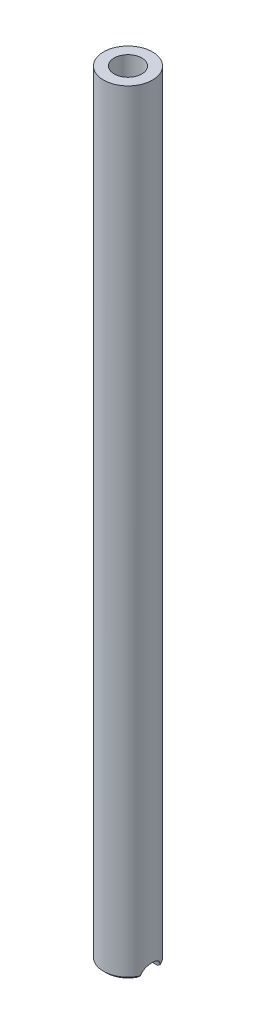
ISO-10303-21;
HEADER;
FILE_DESCRIPTION(('STEP AP214'),'2;1');
FILE_NAME('part.step','',(''),(''),'','','');
FILE_SCHEMA(('AUTOMOTIVE_DESIGN { 1 0 10303 214 1 1 1 1 }'));
ENDSEC;
DATA;
#1=APPLICATION_CONTEXT('core data for automotive mechanical design processes');
#2=APPLICATION_PROTOCOL_DEFINITION('international standard','automotive_design',2000,#1);
#3=PRODUCT_CONTEXT('',#1,'mechanical');
#4=PRODUCT('Part','Part','',(#3));
#5=PRODUCT_RELATED_PRODUCT_CATEGORY('part','',(#4));
#6=PRODUCT_DEFINITION_FORMATION('','',#4);
#7=PRODUCT_DEFINITION_CONTEXT('part definition',#1,'design');
#8=PRODUCT_DEFINITION('design','',#6,#7);
#9=PRODUCT_DEFINITION_SHAPE('','',#8);
#10=(LENGTH_UNIT() NAMED_UNIT(*) SI_UNIT(.MILLI.,.METRE.));
#11=(NAMED_UNIT(*) PLANE_ANGLE_UNIT() SI_UNIT($,.RADIAN.));
#12=(NAMED_UNIT(*) SI_UNIT($,.STERADIAN.) SOLID_ANGLE_UNIT());
#13=UNCERTAINTY_MEASURE_WITH_UNIT(LENGTH_MEASURE(1.E-05),#10,'distance_accuracy_value','');
#14=(GEOMETRIC_REPRESENTATION_CONTEXT(3) GLOBAL_UNCERTAINTY_ASSIGNED_CONTEXT((#13)) GLOBAL_UNIT_ASSIGNED_CONTEXT((#10,
#11,#12)) REPRESENTATION_CONTEXT('',''));
#15=CARTESIAN_POINT('',(0.,0.,0.));
#16=DIRECTION('',(0.,0.,1.));
#17=DIRECTION('',(1.,0.,0.));
#18=AXIS2_PLACEMENT_3D('',#15,#16,#17);
#19=CARTESIAN_POINT('',(0.,0.,0.));
#20=DIRECTION('',(0.,1.,0.));
#21=DIRECTION('',(0.,0.,1.));
#22=AXIS2_PLACEMENT_3D('',#19,#20,#21);
#23=PLANE('',#22);
#24=CARTESIAN_POINT('',(0.,0.,0.));
#25=DIRECTION('',(0.,1.,0.));
#26=DIRECTION('',(0.,0.,1.));
#27=AXIS2_PLACEMENT_3D('',#24,#25,#26);
#28=CIRCLE('',#27,2.69999999999997);
#29=CARTESIAN_POINT('',(2.39321958875483,0.,1.25));
#30=VERTEX_POINT('',#29);
#31=CARTESIAN_POINT('',(-2.39321958875483,0.,1.25));
#32=VERTEX_POINT('',#31);
#33=EDGE_CURVE('E130',#30,#32,#28,.F.);
#34=ORIENTED_EDGE('',*,*,#33,.T.);
#35=DIRECTION('',(1.,0.,0.));
#36=VECTOR('',#35,1.);
#37=CARTESIAN_POINT('',(-3.,0.,1.25));
#38=LINE('',#37,#36);
#39=CARTESIAN_POINT('',(-1.15217186218029,0.,1.25));
#40=VERTEX_POINT('',#39);
#41=EDGE_CURVE('E72',#32,#40,#38,.T.);
#42=ORIENTED_EDGE('',*,*,#41,.T.);
#43=CARTESIAN_POINT('',(0.,0.,0.));
#44=DIRECTION('',(0.,1.,0.));
#45=DIRECTION('',(0.,0.,1.));
#46=AXIS2_PLACEMENT_3D('',#43,#44,#45);
#47=CIRCLE('',#46,1.7);
#48=CARTESIAN_POINT('',(1.15217186218029,0.,1.25));
#49=VERTEX_POINT('',#48);
#50=EDGE_CURVE('E213',#40,#49,#47,.T.);
#51=ORIENTED_EDGE('',*,*,#50,.T.);
#52=EDGE_CURVE('E212',#49,#30,#38,.T.);
#53=ORIENTED_EDGE('',*,*,#52,.T.);
#54=EDGE_LOOP('',(#34,#42,#51,#53));
#55=FACE_BOUND('',#54,.T.);
#56=ADVANCED_FACE('F41',(#55),#23,.F.);
#57=CARTESIAN_POINT('',(0.,0.300000000000022,0.));
#58=DIRECTION('',(0.,1.,0.));
#59=DIRECTION('',(0.,0.,1.));
#60=AXIS2_PLACEMENT_3D('',#57,#58,#59);
#61=CONICAL_SURFACE('',#60,3.,0.785398163397467);
#62=CARTESIAN_POINT('',(2.78004389893349,0.330199999999623,1.20559858991301));
#63=CARTESIAN_POINT('',(2.74479798492367,0.301039250505393,1.21358054683991));
#64=CARTESIAN_POINT('',(2.70950752574411,0.271641005138676,1.22050000654771));
#65=CARTESIAN_POINT('',(2.63903695036296,0.212454470924361,1.23218251707802));
#66=CARTESIAN_POINT('',(2.60385676660136,0.182667230043783,1.23695047222051));
#67=CARTESIAN_POINT('',(2.53364287260164,0.122653263979588,1.24433536313533));
#68=CARTESIAN_POINT('',(2.49860916534385,0.0924265299092034,1.24695225535038));
#69=CARTESIAN_POINT('',(2.42874315256099,0.0314715601289161,1.24997570753094));
#70=CARTESIAN_POINT('',(2.39391149439429,0.000742332058989382,1.25037717720973));
#71=CARTESIAN_POINT('',(2.35928889286577,-0.0302000000000021,1.24963513074817));
#72=B_SPLINE_CURVE_WITH_KNOTS('',3,(#62,#63,#64,#65,#66,#67,#68,#69,#70,#71),.UNSPECIFIED.,.F.,
.F.,(4,2,2,2,4),(0.,0.139296579859182,0.278274011240721,0.417254256733252,0.556553698967687),.UNSPECIFIED.);
#73=CARTESIAN_POINT('',(2.74362898366379,0.300000000000022,1.21346610995115));
#74=VERTEX_POINT('',#73);
#75=EDGE_CURVE('E11',#74,#30,#72,.T.);
#76=ORIENTED_EDGE('',*,*,#75,.F.);
#77=CARTESIAN_POINT('',(0.,0.300000000000022,0.));
#78=DIRECTION('',(0.,1.,0.));
#79=DIRECTION('',(0.,0.,1.));
#80=AXIS2_PLACEMENT_3D('',#77,#78,#79);
#81=CIRCLE('',#80,3.);
#82=CARTESIAN_POINT('',(-2.74362898366379,0.300000000000022,1.21346610995115));
#83=VERTEX_POINT('',#82);
#84=EDGE_CURVE('E107',#83,#74,#81,.T.);
#85=ORIENTED_EDGE('',*,*,#84,.F.);
#86=CARTESIAN_POINT('',(-2.35928889286577,-0.0302000000000022,1.24963513074817));
#87=CARTESIAN_POINT('',(-2.3939114943943,0.000742332058995156,1.25037717720973));
#88=CARTESIAN_POINT('',(-2.42874315256101,0.0314715601289274,1.24997570753094));
#89=CARTESIAN_POINT('',(-2.49860916534387,0.0924265299092255,1.24695225535038));
#90=CARTESIAN_POINT('',(-2.53364287260167,0.122653263979615,1.24433536313533));
#91=CARTESIAN_POINT('',(-2.6038567666014,0.18266723004382,1.2369504722205));
#92=CARTESIAN_POINT('',(-2.63903695036301,0.212454470924404,1.23218251707801));
#93=CARTESIAN_POINT('',(-2.70950752574417,0.271641005138729,1.2205000065477));
#94=CARTESIAN_POINT('',(-2.74479798492374,0.301039250505451,1.2135805468399));
#95=CARTESIAN_POINT('',(-2.78004389893357,0.330199999999686,1.205598589913));
#96=B_SPLINE_CURVE_WITH_KNOTS('',3,(#86,#87,#88,#89,#90,#91,#92,#93,#94,#95),.UNSPECIFIED.,.F.,
.F.,(4,2,2,2,4),(0.,0.13929944223446,0.278279687727017,0.417257119108579,0.556553698967787),.UNSPECIFIED.);
#97=EDGE_CURVE('E114',#32,#83,#96,.T.);
#98=ORIENTED_EDGE('',*,*,#97,.F.);
#99=ORIENTED_EDGE('',*,*,#33,.F.);
#100=EDGE_LOOP('',(#76,#85,#98,#99));
#101=FACE_BOUND('',#100,.T.);
#102=ADVANCED_FACE('F124',(#101),#61,.T.);
#103=CARTESIAN_POINT('',(0.,95.,0.));
#104=DIRECTION('',(0.,-1.,0.));
#105=DIRECTION('',(0.,0.,-1.));
#106=AXIS2_PLACEMENT_3D('',#103,#104,#105);
#107=CYLINDRICAL_SURFACE('',#106,3.);
#108=CARTESIAN_POINT('',(2.74362898366379,0.300000000000022,-1.21346610995115));
#109=VERTEX_POINT('',#108);
#110=CARTESIAN_POINT('',(-2.74362898366379,0.300000000000022,-1.21346610995115));
#111=VERTEX_POINT('',#110);
#112=EDGE_CURVE('E109',#109,#111,#81,.T.);
#113=ORIENTED_EDGE('',*,*,#112,.T.);
#114=CARTESIAN_POINT('',(-2.74362898366379,0.300000000000022,-1.21346610995115));
#115=CARTESIAN_POINT('',(-2.751060054905,0.368455864463638,-1.19658209205574));
#116=CARTESIAN_POINT('',(-2.7609331536276,0.435081513295248,-1.17393074308736));
#117=CARTESIAN_POINT('',(-2.78398978427248,0.563002058486706,-1.11819258930886));
#118=CARTESIAN_POINT('',(-2.79716445453636,0.624310642584936,-1.08513365928918));
#119=CARTESIAN_POINT('',(-2.82528384442318,0.740213004383044,-1.0096396436127));
#120=CARTESIAN_POINT('',(-2.8402256850275,0.794817416343522,-0.967219713565076));
#121=CARTESIAN_POINT('',(-2.87028936262594,0.896330744515326,-0.873980410450537));
#122=CARTESIAN_POINT('',(-2.88541132964195,0.943233688759202,-0.823154579900579));
#123=CARTESIAN_POINT('',(-2.91487778112239,1.02992540620389,-0.711984182172451));
#124=CARTESIAN_POINT('',(-2.92916535313126,1.06934574388158,-0.651335807758729));
#125=CARTESIAN_POINT('',(-2.95466202726987,1.13733154115001,-0.523643070705675));
#126=CARTESIAN_POINT('',(-2.96587246471617,1.16590171122093,-0.456601499453774));
#127=CARTESIAN_POINT('',(-2.98355800407859,1.21017141003826,-0.320756110513793));
#128=CARTESIAN_POINT('',(-2.99020233559345,1.22633385631333,-0.252125907773266));
#129=CARTESIAN_POINT('',(-2.99868714276918,1.2468821028172,-0.112843714150842));
#130=CARTESIAN_POINT('',(-3.00052989830909,1.25127349219473,-0.0421926989057744));
#131=CARTESIAN_POINT('',(-2.9992481198465,1.24819380302362,0.0940122822266089));
#132=CARTESIAN_POINT('',(-2.99645021816439,1.2415028030499,0.159588643183516));
#133=CARTESIAN_POINT('',(-2.98678829034567,1.21799776603746,0.288582028235826));
#134=CARTESIAN_POINT('',(-2.97992423728568,1.20118366197019,0.351999038030486));
#135=CARTESIAN_POINT('',(-2.96279659507227,1.15803885544299,0.475085676545811));
#136=CARTESIAN_POINT('',(-2.95252891532552,1.13169669835846,0.534750692840206));
#137=CARTESIAN_POINT('',(-2.92955510415442,1.07032791809374,0.648924765978427));
#138=CARTESIAN_POINT('',(-2.91684796851908,1.0352977167085,0.703431685629269));
#139=CARTESIAN_POINT('',(-2.88923562099981,0.954831009694065,0.809646669737968));
#140=CARTESIAN_POINT('',(-2.87424018942949,0.908854637051669,0.860922714642156));
#141=CARTESIAN_POINT('',(-2.84428575882966,0.809149733201179,0.955243847629041));
#142=CARTESIAN_POINT('',(-2.82932675363899,0.755422621216253,0.998290439243244));
#143=CARTESIAN_POINT('',(-2.80028029064609,0.638306921053591,1.0771684279978));
#144=CARTESIAN_POINT('',(-2.78627840718246,0.5745615424782,1.11250917785741));
#145=CARTESIAN_POINT('',(-2.76797396971356,0.474616776016498,1.15696961262403));
#146=CARTESIAN_POINT('',(-2.76231477138213,0.440517889267516,1.1703804173556));
#147=CARTESIAN_POINT('',(-2.75209700815376,0.371108426760499,1.19420468847869));
#148=CARTESIAN_POINT('',(-2.74753906509135,0.335797179222732,1.20461646207265));
#149=CARTESIAN_POINT('',(-2.74362898366379,0.300000000000022,1.21346610995115));
#150=B_SPLINE_CURVE_WITH_KNOTS('',3,(#114,#115,#116,#117,#118,#119,#120,#121,#122,#123,#124,
#125,#126,#127,#128,#129,#130,#131,#132,#133,#134,#135,#136,#137,#138,#139,#140,#141,#142,#143,
#144,#145,#146,#147,#148,#149),.UNSPECIFIED.,.F.,.F.,(4,2,2,2,2,2,2,2,2,2,2,2,2,2,2,2,2,4),(0.,
0.212207559242973,0.423851526781467,0.635155320994401,0.846622201032945,1.0667188784059,
1.28671989371306,1.49804944124082,1.70927862720475,1.90626164625781,2.1032459696174,
2.30046789893446,2.49777119015316,2.70829018256221,2.9187706760512,3.14017921358695,
3.2512690669007,3.36242150234821),.UNSPECIFIED.);
#151=EDGE_CURVE('E103',#111,#83,#150,.T.);
#152=ORIENTED_EDGE('',*,*,#151,.T.);
#153=ORIENTED_EDGE('',*,*,#84,.T.);
#154=CARTESIAN_POINT('',(2.74362898366379,0.300000000000022,1.21346610995115));
#155=CARTESIAN_POINT('',(2.751060054905,0.368455864463638,1.19658209205574));
#156=CARTESIAN_POINT('',(2.7609331536276,0.435081513295248,1.17393074308736));
#157=CARTESIAN_POINT('',(2.78398978427248,0.563002058486706,1.11819258930886));
#158=CARTESIAN_POINT('',(2.79716445453636,0.624310642584936,1.08513365928918));
#159=CARTESIAN_POINT('',(2.82528384442318,0.740213004383044,1.0096396436127));
#160=CARTESIAN_POINT('',(2.8402256850275,0.794817416343521,0.967219713565076));
#161=CARTESIAN_POINT('',(2.87028936262594,0.896330744515325,0.873980410450538));
#162=CARTESIAN_POINT('',(2.88541132964195,0.943233688759202,0.82315457990058));
#163=CARTESIAN_POINT('',(2.91487778112239,1.02992540620389,0.711984182172452));
#164=CARTESIAN_POINT('',(2.92916535313126,1.06934574388158,0.65133580775873));
#165=CARTESIAN_POINT('',(2.95466202726987,1.13733154115001,0.523643070705676));
#166=CARTESIAN_POINT('',(2.96587246471617,1.16590171122093,0.456601499453775));
#167=CARTESIAN_POINT('',(2.98355800407859,1.21017141003826,0.320756110513794));
#168=CARTESIAN_POINT('',(2.99020233559345,1.22633385631333,0.252125907773267));
#169=CARTESIAN_POINT('',(2.99868714276918,1.2468821028172,0.112843714150842));
#170=CARTESIAN_POINT('',(3.00052989830909,1.25127349219473,0.0421926989057749));
#171=CARTESIAN_POINT('',(2.9992481198465,1.24819380302362,-0.0940122822266084));
#172=CARTESIAN_POINT('',(2.99645021816439,1.2415028030499,-0.159588643183515));
#173=CARTESIAN_POINT('',(2.98678829034567,1.21799776603746,-0.288582028235826));
#174=CARTESIAN_POINT('',(2.97992423728568,1.20118366197019,-0.351999038030486));
#175=CARTESIAN_POINT('',(2.96279659507227,1.15803885544299,-0.475085676545811));
#176=CARTESIAN_POINT('',(2.95252891532552,1.13169669835846,-0.534750692840205));
#177=CARTESIAN_POINT('',(2.92955510415442,1.07032791809374,-0.648924765978426));
#178=CARTESIAN_POINT('',(2.91684796851908,1.0352977167085,-0.703431685629269));
#179=CARTESIAN_POINT('',(2.88923562099981,0.954831009694065,-0.809646669737968));
#180=CARTESIAN_POINT('',(2.87424018942949,0.908854637051669,-0.860922714642156));
#181=CARTESIAN_POINT('',(2.84428575882966,0.809149733201179,-0.955243847629041));
#182=CARTESIAN_POINT('',(2.82932675363899,0.755422621216253,-0.998290439243244));
#183=CARTESIAN_POINT('',(2.80028029064609,0.638306921053591,-1.0771684279978));
#184=CARTESIAN_POINT('',(2.78627840718246,0.574561542478201,-1.11250917785741));
#185=CARTESIAN_POINT('',(2.76797396971356,0.474616776016498,-1.15696961262403));
#186=CARTESIAN_POINT('',(2.76231477138213,0.440517889267517,-1.1703804173556));
#187=CARTESIAN_POINT('',(2.75209700815376,0.371108426760499,-1.19420468847869));
#188=CARTESIAN_POINT('',(2.74753906509135,0.335797179222732,-1.20461646207265));
#189=CARTESIAN_POINT('',(2.74362898366379,0.300000000000023,-1.21346610995115));
#190=B_SPLINE_CURVE_WITH_KNOTS('',3,(#154,#155,#156,#157,#158,#159,#160,#161,#162,#163,#164,
#165,#166,#167,#168,#169,#170,#171,#172,#173,#174,#175,#176,#177,#178,#179,#180,#181,#182,#183,
#184,#185,#186,#187,#188,#189),.UNSPECIFIED.,.F.,.F.,(4,2,2,2,2,2,2,2,2,2,2,2,2,2,2,2,2,4),(0.,
0.212207559242973,0.423851526781467,0.635155320994401,0.846622201032944,1.0667188784059,
1.28671989371306,1.49804944124082,1.70927862720475,1.90626164625781,2.1032459696174,
2.30046789893446,2.49777119015316,2.70829018256221,2.9187706760512,3.14017921358694,
3.2512690669007,3.36242150234821),.UNSPECIFIED.);
#191=EDGE_CURVE('E177',#74,#109,#190,.T.);
#192=ORIENTED_EDGE('',*,*,#191,.T.);
#193=EDGE_LOOP('',(#113,#152,#153,#192));
#194=FACE_BOUND('',#193,.T.);
#195=CARTESIAN_POINT('',(0.,95.,0.));
#196=DIRECTION('',(0.,1.,0.));
#197=DIRECTION('',(0.,0.,1.));
#198=AXIS2_PLACEMENT_3D('',#195,#196,#197);
#199=CIRCLE('',#198,3.);
#200=CARTESIAN_POINT('',(0.,95.,3.));
#201=VERTEX_POINT('',#200);
#202=EDGE_CURVE('E126',#201,#201,#199,.T.);
#203=ORIENTED_EDGE('',*,*,#202,.F.);
#204=EDGE_LOOP('',(#203));
#205=FACE_BOUND('',#204,.T.);
#206=ADVANCED_FACE('F104',(#194,#205),#107,.T.);
#207=CARTESIAN_POINT('',(0.,95.,0.));
#208=DIRECTION('',(0.,1.,0.));
#209=DIRECTION('',(0.,0.,1.));
#210=AXIS2_PLACEMENT_3D('',#207,#208,#209);
#211=PLANE('',#210);
#212=CARTESIAN_POINT('',(0.,95.,0.));
#213=DIRECTION('',(0.,1.,0.));
#214=DIRECTION('',(0.,0.,1.));
#215=AXIS2_PLACEMENT_3D('',#212,#213,#214);
#216=CIRCLE('',#215,1.7);
#217=CARTESIAN_POINT('',(0.,95.,1.7));
#218=VERTEX_POINT('',#217);
#219=EDGE_CURVE('E216',#218,#218,#216,.T.);
#220=ORIENTED_EDGE('',*,*,#219,.F.);
#221=EDGE_LOOP('',(#220));
#222=FACE_BOUND('',#221,.T.);
#223=ORIENTED_EDGE('',*,*,#202,.T.);
#224=EDGE_LOOP('',(#223));
#225=FACE_BOUND('',#224,.T.);
#226=ADVANCED_FACE('F193',(#222,#225),#211,.T.);
#227=CARTESIAN_POINT('',(-2.39321958875483,0.,-1.25));
#228=VERTEX_POINT('',#227);
#229=CARTESIAN_POINT('',(2.39321958875483,0.,-1.25));
#230=VERTEX_POINT('',#229);
#231=EDGE_CURVE('E121',#228,#230,#28,.F.);
#232=ORIENTED_EDGE('',*,*,#231,.T.);
#233=DIRECTION('',(1.,0.,0.));
#234=VECTOR('',#233,1.);
#235=CARTESIAN_POINT('',(-3.,0.,-1.25));
#236=LINE('',#235,#234);
#237=CARTESIAN_POINT('',(1.15217186218029,0.,-1.25));
#238=VERTEX_POINT('',#237);
#239=EDGE_CURVE('E64',#230,#238,#236,.F.);
#240=ORIENTED_EDGE('',*,*,#239,.T.);
#241=CARTESIAN_POINT('',(-1.15217186218029,0.,-1.25));
#242=VERTEX_POINT('',#241);
#243=EDGE_CURVE('E132',#238,#242,#47,.T.);
#244=ORIENTED_EDGE('',*,*,#243,.T.);
#245=EDGE_CURVE('E184',#242,#228,#236,.F.);
#246=ORIENTED_EDGE('',*,*,#245,.T.);
#247=EDGE_LOOP('',(#232,#240,#244,#246));
#248=FACE_BOUND('',#247,.T.);
#249=ADVANCED_FACE('F194',(#248),#23,.F.);
#250=CARTESIAN_POINT('',(0.,0.,0.));
#251=DIRECTION('',(0.,1.,0.));
#252=DIRECTION('',(0.,0.,1.));
#253=AXIS2_PLACEMENT_3D('',#250,#251,#252);
#254=CYLINDRICAL_SURFACE('',#253,1.7);
#255=ORIENTED_EDGE('',*,*,#50,.F.);
#256=CARTESIAN_POINT('',(-1.15217186218029,0.,1.25));
#257=CARTESIAN_POINT('',(-1.1521540899547,0.0297051466107362,1.25000630450715));
#258=CARTESIAN_POINT('',(-1.15332174879054,0.0593847221858209,1.24894060891229));
#259=CARTESIAN_POINT('',(-1.15786773204684,0.11837031891241,1.2447320161652));
#260=CARTESIAN_POINT('',(-1.16124181921655,0.147676946525465,1.24159310033373));
#261=CARTESIAN_POINT('',(-1.1743268914488,0.233970858054492,1.22926798870381));
#262=CARTESIAN_POINT('',(-1.18700910991442,0.290117901568079,1.21716955337492));
#263=CARTESIAN_POINT('',(-1.21796118296609,0.398272887247139,1.18618602719933));
#264=CARTESIAN_POINT('',(-1.23619128914568,0.450307059782674,1.16734905208315));
#265=CARTESIAN_POINT('',(-1.27610820937935,0.550516987375731,1.12357898133538));
#266=CARTESIAN_POINT('',(-1.29780715302868,0.598678277384545,1.09862432411704));
#267=CARTESIAN_POINT('',(-1.34724598478576,0.699925156034752,1.03766741502119));
#268=CARTESIAN_POINT('',(-1.3753340260917,0.752112868883314,1.00045735012618));
#269=CARTESIAN_POINT('',(-1.4313836121581,0.850280308006511,0.918484052279946));
#270=CARTESIAN_POINT('',(-1.45934507730188,0.896256542624432,0.873716602640341));
#271=CARTESIAN_POINT('',(-1.51830686796386,0.989599252387722,0.767533705898734));
#272=CARTESIAN_POINT('',(-1.54885314755543,1.03552356501881,0.704572657941425));
#273=CARTESIAN_POINT('',(-1.60355062895877,1.11567367929434,0.569142601689355));
#274=CARTESIAN_POINT('',(-1.6277151377284,1.14992386732399,0.496693856488348));
#275=CARTESIAN_POINT('',(-1.66093160836044,1.1963991890053,0.366625268428228));
#276=CARTESIAN_POINT('',(-1.67233598938644,1.21213516508566,0.310850412328854));
#277=CARTESIAN_POINT('',(-1.68954664396107,1.23577309246722,0.196835689263943));
#278=CARTESIAN_POINT('',(-1.69535777308365,1.24368183885601,0.138598006250379));
#279=CARTESIAN_POINT('',(-1.70088709773096,1.25120878448093,0.0211542971693632));
#280=CARTESIAN_POINT('',(-1.70059063733024,1.25080704164863,-0.0380537174062736));
#281=CARTESIAN_POINT('',(-1.69389681335986,1.24169071214258,-0.155479091389756));
#282=CARTESIAN_POINT('',(-1.6874979287251,1.23297405292693,-0.213696200125995));
#283=CARTESIAN_POINT('',(-1.66944048577033,1.20813955335051,-0.325717677185374));
#284=CARTESIAN_POINT('',(-1.65794995885032,1.19225788669021,-0.379602725454546));
#285=CARTESIAN_POINT('',(-1.63060131779162,1.15392401142064,-0.483780446987167));
#286=CARTESIAN_POINT('',(-1.61474226639481,1.13147039274756,-0.534072346428433));
#287=CARTESIAN_POINT('',(-1.57771394413741,1.07800488782843,-0.635652006372165));
#288=CARTESIAN_POINT('',(-1.55615267527961,1.0463237409826,-0.686442057864704));
#289=CARTESIAN_POINT('',(-1.51027745464087,0.976791120063535,-0.782232946402042));
#290=CARTESIAN_POINT('',(-1.48596111648765,0.938934284087191,-0.827228691376397));
#291=CARTESIAN_POINT('',(-1.43124071929692,0.849950075114403,-0.919201888990724));
#292=CARTESIAN_POINT('',(-1.40056376457877,0.797670138289086,-0.964903229438648));
#293=CARTESIAN_POINT('',(-1.3400553897015,0.685904382890874,-1.04731113399172));
#294=CARTESIAN_POINT('',(-1.31022456804775,0.626413613283527,-1.08401146503336));
#295=CARTESIAN_POINT('',(-1.26073857990928,0.513760187039348,-1.14089856218714));
#296=CARTESIAN_POINT('',(-1.24026257527466,0.461896206458517,-1.16293492832742));
#297=CARTESIAN_POINT('',(-1.20434739558084,0.354264359011205,-1.20008900052493));
#298=CARTESIAN_POINT('',(-1.18888539179289,0.298515631148429,-1.2152381943772));
#299=CARTESIAN_POINT('',(-1.16915630020933,0.202175074991398,-1.23418182505141));
#300=CARTESIAN_POINT('',(-1.16289269688235,0.162402558068378,-1.24005526897832));
#301=CARTESIAN_POINT('',(-1.15435270758082,0.0817836531981615,-1.24799083568458));
#302=CARTESIAN_POINT('',(-1.15210450762944,0.0409317009956948,-1.25002602143386));
#303=CARTESIAN_POINT('',(-1.15217186218029,0.,-1.25));
#304=B_SPLINE_CURVE_WITH_KNOTS('',3,(#256,#257,#258,#259,#260,#261,#262,#263,#264,#265,#266,
#267,#268,#269,#270,#271,#272,#273,#274,#275,#276,#277,#278,#279,#280,#281,#282,#283,#284,#285,
#286,#287,#288,#289,#290,#291,#292,#293,#294,#295,#296,#297,#298,#299,#300,#301,#302,#303),
.UNSPECIFIED.,.F.,.F.,(4,2,2,2,2,2,2,2,2,2,2,2,2,2,2,2,2,2,2,2,2,2,2,4),(0.,0.0890280355267835,
0.177885600689115,0.353286522495761,0.527459226368193,0.702254851965328,0.911471168816724,
1.12080460734787,1.37051264405821,1.6196958155868,1.79613784876839,1.97242657183038,
2.14913837091284,2.32589422796507,2.4972071547122,2.66855686496879,2.85873327535566,
3.04907568961331,3.27593741829751,3.50295580453533,3.68225124588761,3.86071850414636,
3.98241848582283,4.1049694291331),.UNSPECIFIED.);
#305=EDGE_CURVE('E112',#40,#242,#304,.T.);
#306=ORIENTED_EDGE('',*,*,#305,.T.);
#307=ORIENTED_EDGE('',*,*,#243,.F.);
#308=CARTESIAN_POINT('',(1.15217186218029,0.,-1.25));
#309=CARTESIAN_POINT('',(1.1521540899547,0.0297051466107362,-1.25000630450715));
#310=CARTESIAN_POINT('',(1.15332174879054,0.0593847221858208,-1.24894060891229));
#311=CARTESIAN_POINT('',(1.15786773204684,0.11837031891241,-1.2447320161652));
#312=CARTESIAN_POINT('',(1.16124181921655,0.147676946525464,-1.24159310033373));
#313=CARTESIAN_POINT('',(1.1743268914488,0.233970858054492,-1.22926798870381));
#314=CARTESIAN_POINT('',(1.18700910991442,0.290117901568079,-1.21716955337492));
#315=CARTESIAN_POINT('',(1.21796118296609,0.398272887247138,-1.18618602719933));
#316=CARTESIAN_POINT('',(1.23619128914568,0.450307059782673,-1.16734905208315));
#317=CARTESIAN_POINT('',(1.27610820937935,0.550516987375731,-1.12357898133538));
#318=CARTESIAN_POINT('',(1.29780715302868,0.598678277384544,-1.09862432411704));
#319=CARTESIAN_POINT('',(1.34724598478576,0.699925156034752,-1.03766741502119));
#320=CARTESIAN_POINT('',(1.3753340260917,0.752112868883313,-1.00045735012618));
#321=CARTESIAN_POINT('',(1.4313836121581,0.850280308006511,-0.918484052279947));
#322=CARTESIAN_POINT('',(1.45934507730188,0.896256542624431,-0.873716602640342));
#323=CARTESIAN_POINT('',(1.51830686796386,0.98959925238772,-0.767533705898735));
#324=CARTESIAN_POINT('',(1.54885314755543,1.03552356501881,-0.704572657941426));
#325=CARTESIAN_POINT('',(1.60355062895876,1.11567367929434,-0.569142601689356));
#326=CARTESIAN_POINT('',(1.6277151377284,1.14992386732399,-0.496693856488349));
#327=CARTESIAN_POINT('',(1.66093160836044,1.19639918900529,-0.366625268428229));
#328=CARTESIAN_POINT('',(1.67233598938644,1.21213516508566,-0.310850412328855));
#329=CARTESIAN_POINT('',(1.68954664396107,1.23577309246722,-0.196835689263944));
#330=CARTESIAN_POINT('',(1.69535777308365,1.24368183885601,-0.13859800625038));
#331=CARTESIAN_POINT('',(1.70088709773096,1.25120878448093,-0.0211542971693642));
#332=CARTESIAN_POINT('',(1.70059063733024,1.25080704164863,0.0380537174062726));
#333=CARTESIAN_POINT('',(1.69389681335986,1.24169071214259,0.155479091389755));
#334=CARTESIAN_POINT('',(1.6874979287251,1.23297405292693,0.213696200125994));
#335=CARTESIAN_POINT('',(1.66944048577033,1.20813955335051,0.325717677185374));
#336=CARTESIAN_POINT('',(1.65794995885032,1.19225788669021,0.379602725454545));
#337=CARTESIAN_POINT('',(1.63060131779162,1.15392401142064,0.483780446987167));
#338=CARTESIAN_POINT('',(1.61474226639481,1.13147039274756,0.534072346428433));
#339=CARTESIAN_POINT('',(1.57771394413741,1.07800488782843,0.635652006372165));
#340=CARTESIAN_POINT('',(1.55615267527961,1.0463237409826,0.686442057864704));
#341=CARTESIAN_POINT('',(1.51027745464087,0.976791120063535,0.782232946402042));
#342=CARTESIAN_POINT('',(1.48596111648765,0.938934284087191,0.827228691376397));
#343=CARTESIAN_POINT('',(1.43124071929692,0.849950075114402,0.919201888990724));
#344=CARTESIAN_POINT('',(1.40056376457877,0.797670138289086,0.964903229438648));
#345=CARTESIAN_POINT('',(1.3400553897015,0.685904382890874,1.04731113399172));
#346=CARTESIAN_POINT('',(1.31022456804775,0.626413613283526,1.08401146503336));
#347=CARTESIAN_POINT('',(1.26073857990928,0.513760187039348,1.14089856218714));
#348=CARTESIAN_POINT('',(1.24026257527466,0.461896206458517,1.16293492832742));
#349=CARTESIAN_POINT('',(1.20434739558084,0.354264359011205,1.20008900052493));
#350=CARTESIAN_POINT('',(1.18888539179289,0.29851563114843,1.2152381943772));
#351=CARTESIAN_POINT('',(1.16915630020933,0.202175074991398,1.23418182505141));
#352=CARTESIAN_POINT('',(1.16289269688235,0.162402558068378,1.24005526897832));
#353=CARTESIAN_POINT('',(1.15435270758082,0.0817836531981614,1.24799083568458));
#354=CARTESIAN_POINT('',(1.15210450762944,0.0409317009956948,1.25002602143386));
#355=CARTESIAN_POINT('',(1.15217186218029,0.,1.25));
#356=B_SPLINE_CURVE_WITH_KNOTS('',3,(#308,#309,#310,#311,#312,#313,#314,#315,#316,#317,#318,
#319,#320,#321,#322,#323,#324,#325,#326,#327,#328,#329,#330,#331,#332,#333,#334,#335,#336,#337,
#338,#339,#340,#341,#342,#343,#344,#345,#346,#347,#348,#349,#350,#351,#352,#353,#354,#355),
.UNSPECIFIED.,.F.,.F.,(4,2,2,2,2,2,2,2,2,2,2,2,2,2,2,2,2,2,2,2,2,2,2,4),(0.,0.0890280355267834,
0.177885600689115,0.353286522495761,0.527459226368193,0.702254851965327,0.911471168816723,
1.12080460734787,1.37051264405821,1.6196958155868,1.79613784876839,1.97242657183038,
2.14913837091284,2.32589422796507,2.4972071547122,2.66855686496879,2.85873327535566,
3.04907568961331,3.27593741829751,3.50295580453533,3.68225124588761,3.86071850414636,
3.98241848582283,4.1049694291331),.UNSPECIFIED.);
#357=EDGE_CURVE('E183',#238,#49,#356,.T.);
#358=ORIENTED_EDGE('',*,*,#357,.T.);
#359=EDGE_LOOP('',(#255,#306,#307,#358));
#360=FACE_BOUND('',#359,.T.);
#361=ORIENTED_EDGE('',*,*,#219,.T.);
#362=EDGE_LOOP('',(#361));
#363=FACE_BOUND('',#362,.T.);
#364=ADVANCED_FACE('F150',(#360,#363),#254,.F.);
#365=CARTESIAN_POINT('',(-2.78004389893357,0.330199999999687,-1.205598589913));
#366=CARTESIAN_POINT('',(-2.74479798492374,0.301039250505451,-1.2135805468399));
#367=CARTESIAN_POINT('',(-2.70950752574417,0.271641005138729,-1.2205000065477));
#368=CARTESIAN_POINT('',(-2.63903695036301,0.212454470924404,-1.23218251707801));
#369=CARTESIAN_POINT('',(-2.6038567666014,0.18266723004382,-1.2369504722205));
#370=CARTESIAN_POINT('',(-2.53364287260167,0.122653263979615,-1.24433536313533));
#371=CARTESIAN_POINT('',(-2.49860916534387,0.0924265299092255,-1.24695225535038));
#372=CARTESIAN_POINT('',(-2.42874315256101,0.0314715601289274,-1.24997570753094));
#373=CARTESIAN_POINT('',(-2.3939114943943,0.00074233205899519,-1.25037717720973));
#374=CARTESIAN_POINT('',(-2.35928889286577,-0.030200000000002,-1.24963513074817));
#375=B_SPLINE_CURVE_WITH_KNOTS('',3,(#365,#366,#367,#368,#369,#370,#371,#372,#373,#374),
.UNSPECIFIED.,.F.,.F.,(4,2,2,2,4),(0.,0.139296579859208,0.278274011240771,0.417254256733327,
0.556553698967787),.UNSPECIFIED.);
#376=EDGE_CURVE('E57',#111,#228,#375,.T.);
#377=ORIENTED_EDGE('',*,*,#376,.F.);
#378=ORIENTED_EDGE('',*,*,#112,.F.);
#379=CARTESIAN_POINT('',(2.35928889286577,-0.0302000000000022,-1.24963513074817));
#380=CARTESIAN_POINT('',(2.39391149439429,0.000742332058989213,-1.25037717720973));
#381=CARTESIAN_POINT('',(2.42874315256099,0.031471560128916,-1.24997570753094));
#382=CARTESIAN_POINT('',(2.49860916534385,0.0924265299092034,-1.24695225535038));
#383=CARTESIAN_POINT('',(2.53364287260164,0.122653263979588,-1.24433536313533));
#384=CARTESIAN_POINT('',(2.60385676660136,0.182667230043782,-1.23695047222051));
#385=CARTESIAN_POINT('',(2.63903695036296,0.212454470924361,-1.23218251707802));
#386=CARTESIAN_POINT('',(2.70950752574411,0.271641005138675,-1.22050000654771));
#387=CARTESIAN_POINT('',(2.74479798492367,0.301039250505392,-1.21358054683991));
#388=CARTESIAN_POINT('',(2.78004389893349,0.330199999999623,-1.20559858991301));
#389=B_SPLINE_CURVE_WITH_KNOTS('',3,(#379,#380,#381,#382,#383,#384,#385,#386,#387,#388),
.UNSPECIFIED.,.F.,.F.,(4,2,2,2,4),(0.,0.139299442234435,0.278279687726966,0.417257119108504,
0.556553698967687),.UNSPECIFIED.);
#390=EDGE_CURVE('E120',#230,#109,#389,.T.);
#391=ORIENTED_EDGE('',*,*,#390,.F.);
#392=ORIENTED_EDGE('',*,*,#231,.F.);
#393=EDGE_LOOP('',(#377,#378,#391,#392));
#394=FACE_BOUND('',#393,.T.);
#395=ADVANCED_FACE('F44',(#394),#61,.T.);
#396=CARTESIAN_POINT('',(-3.,0.,0.));
#397=DIRECTION('',(1.,0.,0.));
#398=DIRECTION('',(0.,0.,-1.));
#399=AXIS2_PLACEMENT_3D('',#396,#397,#398);
#400=CYLINDRICAL_SURFACE('',#399,1.25);
#401=ORIENTED_EDGE('',*,*,#305,.F.);
#402=ORIENTED_EDGE('',*,*,#41,.F.);
#403=ORIENTED_EDGE('',*,*,#97,.T.);
#404=ORIENTED_EDGE('',*,*,#151,.F.);
#405=ORIENTED_EDGE('',*,*,#376,.T.);
#406=ORIENTED_EDGE('',*,*,#245,.F.);
#407=EDGE_LOOP('',(#401,#402,#403,#404,#405,#406));
#408=FACE_BOUND('',#407,.T.);
#409=ADVANCED_FACE('F115',(#408),#400,.F.);
#410=ORIENTED_EDGE('',*,*,#357,.F.);
#411=ORIENTED_EDGE('',*,*,#239,.F.);
#412=ORIENTED_EDGE('',*,*,#390,.T.);
#413=ORIENTED_EDGE('',*,*,#191,.F.);
#414=ORIENTED_EDGE('',*,*,#75,.T.);
#415=ORIENTED_EDGE('',*,*,#52,.F.);
#416=EDGE_LOOP('',(#410,#411,#412,#413,#414,#415));
#417=FACE_BOUND('',#416,.T.);
#418=ADVANCED_FACE('F146',(#417),#400,.F.);
#419=CLOSED_SHELL('',(#56,#102,#206,#226,#249,#364,#395,#409,#418));
#420=MANIFOLD_SOLID_BREP('B2',#419);
#421=ADVANCED_BREP_SHAPE_REPRESENTATION('',(#18,#420),#14);
#422=SHAPE_DEFINITION_REPRESENTATION(#9,#421);
ENDSEC;
END-ISO-10303-21;
